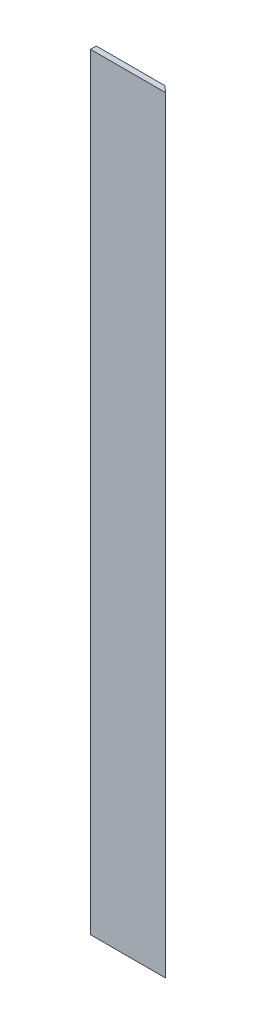
ISO-10303-21;
HEADER;
FILE_DESCRIPTION(('STEP AP214'),'2;1');
FILE_NAME('part.step','',(''),(''),'','','');
FILE_SCHEMA(('AUTOMOTIVE_DESIGN { 1 0 10303 214 1 1 1 1 }'));
ENDSEC;
DATA;
#1=APPLICATION_CONTEXT('core data for automotive mechanical design processes');
#2=APPLICATION_PROTOCOL_DEFINITION('international standard','automotive_design',2000,#1);
#3=PRODUCT_CONTEXT('',#1,'mechanical');
#4=PRODUCT('Part','Part','',(#3));
#5=PRODUCT_RELATED_PRODUCT_CATEGORY('part','',(#4));
#6=PRODUCT_DEFINITION_FORMATION('','',#4);
#7=PRODUCT_DEFINITION_CONTEXT('part definition',#1,'design');
#8=PRODUCT_DEFINITION('design','',#6,#7);
#9=PRODUCT_DEFINITION_SHAPE('','',#8);
#10=(LENGTH_UNIT() NAMED_UNIT(*) SI_UNIT(.MILLI.,.METRE.));
#11=(NAMED_UNIT(*) PLANE_ANGLE_UNIT() SI_UNIT($,.RADIAN.));
#12=(NAMED_UNIT(*) SI_UNIT($,.STERADIAN.) SOLID_ANGLE_UNIT());
#13=UNCERTAINTY_MEASURE_WITH_UNIT(LENGTH_MEASURE(1.E-05),#10,'distance_accuracy_value','');
#14=(GEOMETRIC_REPRESENTATION_CONTEXT(3) GLOBAL_UNCERTAINTY_ASSIGNED_CONTEXT((#13)) GLOBAL_UNIT_ASSIGNED_CONTEXT((#10,
#11,#12)) REPRESENTATION_CONTEXT('',''));
#15=CARTESIAN_POINT('',(0.,0.,0.));
#16=DIRECTION('',(0.,0.,1.));
#17=DIRECTION('',(1.,0.,0.));
#18=AXIS2_PLACEMENT_3D('',#15,#16,#17);
#19=CARTESIAN_POINT('',(0.,533.,1.));
#20=DIRECTION('',(1.,0.,0.));
#21=DIRECTION('',(0.,0.,-1.));
#22=AXIS2_PLACEMENT_3D('',#19,#20,#21);
#23=PLANE('',#22);
#24=DIRECTION('',(0.,0.,1.));
#25=VECTOR('',#24,1.);
#26=CARTESIAN_POINT('',(0.,0.,1.));
#27=LINE('',#26,#25);
#28=CARTESIAN_POINT('',(0.,0.,1.));
#29=VERTEX_POINT('',#28);
#30=CARTESIAN_POINT('',(0.,0.,5.));
#31=VERTEX_POINT('',#30);
#32=EDGE_CURVE('E96',#29,#31,#27,.T.);
#33=ORIENTED_EDGE('',*,*,#32,.T.);
#34=DIRECTION('',(0.,-1.,0.));
#35=VECTOR('',#34,1.);
#36=CARTESIAN_POINT('',(0.,533.,5.));
#37=LINE('',#36,#35);
#38=CARTESIAN_POINT('',(0.,533.,5.));
#39=VERTEX_POINT('',#38);
#40=EDGE_CURVE('E11',#39,#31,#37,.T.);
#41=ORIENTED_EDGE('',*,*,#40,.F.);
#42=DIRECTION('',(0.,0.,1.));
#43=VECTOR('',#42,1.);
#44=CARTESIAN_POINT('',(0.,533.,1.));
#45=LINE('',#44,#43);
#46=CARTESIAN_POINT('',(0.,533.,1.));
#47=VERTEX_POINT('',#46);
#48=EDGE_CURVE('E84',#47,#39,#45,.T.);
#49=ORIENTED_EDGE('',*,*,#48,.F.);
#50=DIRECTION('',(0.,-1.,0.));
#51=VECTOR('',#50,1.);
#52=CARTESIAN_POINT('',(0.,533.,1.));
#53=LINE('',#52,#51);
#54=EDGE_CURVE('E92',#47,#29,#53,.T.);
#55=ORIENTED_EDGE('',*,*,#54,.T.);
#56=EDGE_LOOP('',(#33,#41,#49,#55));
#57=FACE_BOUND('',#56,.T.);
#58=ADVANCED_FACE('F33',(#57),#23,.F.);
#59=CARTESIAN_POINT('',(0.,533.,5.));
#60=DIRECTION('',(0.,0.,-1.));
#61=DIRECTION('',(-1.,0.,0.));
#62=AXIS2_PLACEMENT_3D('',#59,#60,#61);
#63=PLANE('',#62);
#64=DIRECTION('',(1.,0.,0.));
#65=VECTOR('',#64,1.);
#66=CARTESIAN_POINT('',(0.,0.,5.));
#67=LINE('',#66,#65);
#68=CARTESIAN_POINT('',(52.1028954514419,0.,5.));
#69=VERTEX_POINT('',#68);
#70=EDGE_CURVE('E88',#31,#69,#67,.T.);
#71=ORIENTED_EDGE('',*,*,#70,.T.);
#72=DIRECTION('',(0.,-1.,0.));
#73=VECTOR('',#72,1.);
#74=CARTESIAN_POINT('',(52.1028954514419,533.,5.));
#75=LINE('',#74,#73);
#76=CARTESIAN_POINT('',(52.1028954514419,533.,5.));
#77=VERTEX_POINT('',#76);
#78=EDGE_CURVE('E41',#77,#69,#75,.T.);
#79=ORIENTED_EDGE('',*,*,#78,.F.);
#80=DIRECTION('',(1.,0.,0.));
#81=VECTOR('',#80,1.);
#82=CARTESIAN_POINT('',(0.,533.,5.));
#83=LINE('',#82,#81);
#84=EDGE_CURVE('E79',#39,#77,#83,.T.);
#85=ORIENTED_EDGE('',*,*,#84,.F.);
#86=ORIENTED_EDGE('',*,*,#40,.T.);
#87=EDGE_LOOP('',(#71,#79,#85,#86));
#88=FACE_BOUND('',#87,.T.);
#89=ADVANCED_FACE('F87',(#88),#63,.F.);
#90=CARTESIAN_POINT('',(47.7620458724822,533.,1.));
#91=DIRECTION('',(-0.677645215353184,0.,0.735388986937482));
#92=DIRECTION('',(0.735388986937482,0.,0.677645215353184));
#93=AXIS2_PLACEMENT_3D('',#90,#91,#92);
#94=PLANE('',#93);
#95=DIRECTION('',(-0.735388986937482,0.,-0.677645215353184));
#96=VECTOR('',#95,1.);
#97=CARTESIAN_POINT('',(47.7620458724822,0.,1.));
#98=LINE('',#97,#96);
#99=CARTESIAN_POINT('',(47.7620458724822,0.,1.));
#100=VERTEX_POINT('',#99);
#101=EDGE_CURVE('E66',#69,#100,#98,.T.);
#102=ORIENTED_EDGE('',*,*,#101,.T.);
#103=DIRECTION('',(0.,-1.,0.));
#104=VECTOR('',#103,1.);
#105=CARTESIAN_POINT('',(47.7620458724822,533.,1.));
#106=LINE('',#105,#104);
#107=CARTESIAN_POINT('',(47.7620458724822,533.,1.));
#108=VERTEX_POINT('',#107);
#109=EDGE_CURVE('E89',#108,#100,#106,.T.);
#110=ORIENTED_EDGE('',*,*,#109,.F.);
#111=DIRECTION('',(-0.735388986937482,0.,-0.677645215353184));
#112=VECTOR('',#111,1.);
#113=CARTESIAN_POINT('',(47.7620458724822,533.,1.));
#114=LINE('',#113,#112);
#115=EDGE_CURVE('E82',#77,#108,#114,.T.);
#116=ORIENTED_EDGE('',*,*,#115,.F.);
#117=ORIENTED_EDGE('',*,*,#78,.T.);
#118=EDGE_LOOP('',(#102,#110,#116,#117));
#119=FACE_BOUND('',#118,.T.);
#120=ADVANCED_FACE('F90',(#119),#94,.F.);
#121=CARTESIAN_POINT('',(0.,533.,1.));
#122=DIRECTION('',(0.,0.,1.));
#123=DIRECTION('',(1.,0.,0.));
#124=AXIS2_PLACEMENT_3D('',#121,#122,#123);
#125=PLANE('',#124);
#126=DIRECTION('',(-1.,0.,0.));
#127=VECTOR('',#126,1.);
#128=CARTESIAN_POINT('',(0.,0.,1.));
#129=LINE('',#128,#127);
#130=EDGE_CURVE('E72',#100,#29,#129,.T.);
#131=ORIENTED_EDGE('',*,*,#130,.T.);
#132=ORIENTED_EDGE('',*,*,#54,.F.);
#133=DIRECTION('',(-1.,0.,0.));
#134=VECTOR('',#133,1.);
#135=CARTESIAN_POINT('',(0.,533.,1.));
#136=LINE('',#135,#134);
#137=EDGE_CURVE('E49',#108,#47,#136,.T.);
#138=ORIENTED_EDGE('',*,*,#137,.F.);
#139=ORIENTED_EDGE('',*,*,#109,.T.);
#140=EDGE_LOOP('',(#131,#132,#138,#139));
#141=FACE_BOUND('',#140,.T.);
#142=ADVANCED_FACE('F103',(#141),#125,.F.);
#143=CARTESIAN_POINT('',(0.,533.,5.));
#144=DIRECTION('',(0.,1.,0.));
#145=DIRECTION('',(0.,0.,1.));
#146=AXIS2_PLACEMENT_3D('',#143,#144,#145);
#147=PLANE('',#146);
#148=ORIENTED_EDGE('',*,*,#48,.T.);
#149=ORIENTED_EDGE('',*,*,#84,.T.);
#150=ORIENTED_EDGE('',*,*,#115,.T.);
#151=ORIENTED_EDGE('',*,*,#137,.T.);
#152=EDGE_LOOP('',(#148,#149,#150,#151));
#153=FACE_BOUND('',#152,.T.);
#154=ADVANCED_FACE('F80',(#153),#147,.T.);
#155=CARTESIAN_POINT('',(0.,0.,5.));
#156=DIRECTION('',(0.,1.,0.));
#157=DIRECTION('',(0.,0.,1.));
#158=AXIS2_PLACEMENT_3D('',#155,#156,#157);
#159=PLANE('',#158);
#160=ORIENTED_EDGE('',*,*,#32,.F.);
#161=ORIENTED_EDGE('',*,*,#130,.F.);
#162=ORIENTED_EDGE('',*,*,#101,.F.);
#163=ORIENTED_EDGE('',*,*,#70,.F.);
#164=EDGE_LOOP('',(#160,#161,#162,#163));
#165=FACE_BOUND('',#164,.T.);
#166=ADVANCED_FACE('F106',(#165),#159,.F.);
#167=CLOSED_SHELL('',(#58,#89,#120,#142,#154,#166));
#168=MANIFOLD_SOLID_BREP('B2',#167);
#169=ADVANCED_BREP_SHAPE_REPRESENTATION('',(#18,#168),#14);
#170=SHAPE_DEFINITION_REPRESENTATION(#9,#169);
ENDSEC;
END-ISO-10303-21;
